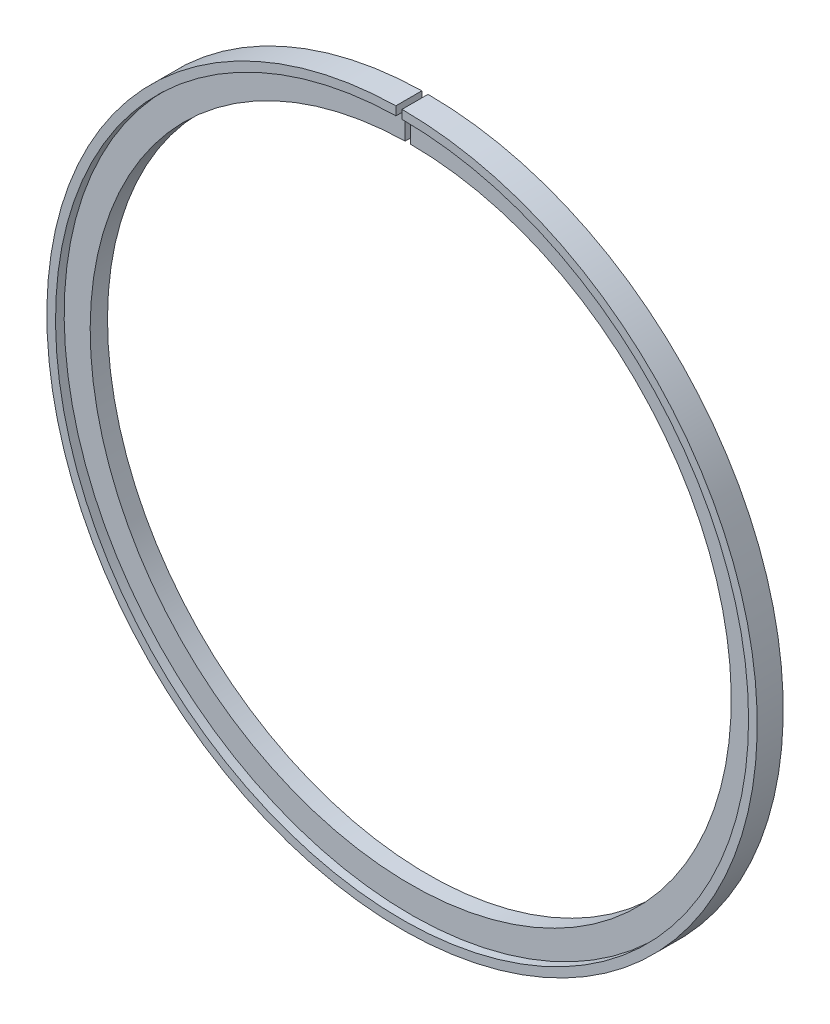
ISO-10303-21;
HEADER;
FILE_DESCRIPTION(('STEP AP214'),'2;1');
FILE_NAME('part.step','',(''),(''),'','','');
FILE_SCHEMA(('AUTOMOTIVE_DESIGN { 1 0 10303 214 1 1 1 1 }'));
ENDSEC;
DATA;
#1=APPLICATION_CONTEXT('core data for automotive mechanical design processes');
#2=APPLICATION_PROTOCOL_DEFINITION('international standard','automotive_design',2000,#1);
#3=PRODUCT_CONTEXT('',#1,'mechanical');
#4=PRODUCT('Part','Part','',(#3));
#5=PRODUCT_RELATED_PRODUCT_CATEGORY('part','',(#4));
#6=PRODUCT_DEFINITION_FORMATION('','',#4);
#7=PRODUCT_DEFINITION_CONTEXT('part definition',#1,'design');
#8=PRODUCT_DEFINITION('design','',#6,#7);
#9=PRODUCT_DEFINITION_SHAPE('','',#8);
#10=(LENGTH_UNIT() NAMED_UNIT(*) SI_UNIT(.MILLI.,.METRE.));
#11=(NAMED_UNIT(*) PLANE_ANGLE_UNIT() SI_UNIT($,.RADIAN.));
#12=(NAMED_UNIT(*) SI_UNIT($,.STERADIAN.) SOLID_ANGLE_UNIT());
#13=UNCERTAINTY_MEASURE_WITH_UNIT(LENGTH_MEASURE(1.E-05),#10,'distance_accuracy_value','');
#14=(GEOMETRIC_REPRESENTATION_CONTEXT(3) GLOBAL_UNCERTAINTY_ASSIGNED_CONTEXT((#13)) GLOBAL_UNIT_ASSIGNED_CONTEXT((#10,
#11,#12)) REPRESENTATION_CONTEXT('',''));
#15=CARTESIAN_POINT('',(0.,0.,0.));
#16=DIRECTION('',(0.,0.,1.));
#17=DIRECTION('',(1.,0.,0.));
#18=AXIS2_PLACEMENT_3D('',#15,#16,#17);
#19=CARTESIAN_POINT('',(0.,0.,2.));
#20=DIRECTION('',(0.,0.,1.));
#21=DIRECTION('',(1.,0.,0.));
#22=AXIS2_PLACEMENT_3D('',#19,#20,#21);
#23=PLANE('',#22);
#24=CARTESIAN_POINT('',(0.,0.,2.));
#25=DIRECTION('',(0.,0.,-1.));
#26=DIRECTION('',(1.,0.,0.));
#27=AXIS2_PLACEMENT_3D('',#24,#25,#26);
#28=CIRCLE('',#27,40.);
#29=CARTESIAN_POINT('',(-1.16927301174741E-13,40.,2.));
#30=VERTEX_POINT('',#29);
#31=CARTESIAN_POINT('',(-0.698096257491339,39.9939078062557,2.));
#32=VERTEX_POINT('',#31);
#33=EDGE_CURVE('E61',#30,#32,#28,.T.);
#34=ORIENTED_EDGE('',*,*,#33,.F.);
#35=DIRECTION('',(0.,-1.,0.));
#36=VECTOR('',#35,1.);
#37=CARTESIAN_POINT('',(0.,37.,2.));
#38=LINE('',#37,#36);
#39=CARTESIAN_POINT('',(0.,37.,2.));
#40=VERTEX_POINT('',#39);
#41=EDGE_CURVE('E66',#30,#40,#38,.T.);
#42=ORIENTED_EDGE('',*,*,#41,.T.);
#43=CARTESIAN_POINT('',(0.,0.,2.));
#44=DIRECTION('',(0.,0.,-1.));
#45=DIRECTION('',(1.,0.,0.));
#46=AXIS2_PLACEMENT_3D('',#43,#44,#45);
#47=CIRCLE('',#46,37.);
#48=CARTESIAN_POINT('',(-0.645739038179502,36.9943647207865,2.));
#49=VERTEX_POINT('',#48);
#50=EDGE_CURVE('E98',#40,#49,#47,.T.);
#51=ORIENTED_EDGE('',*,*,#50,.T.);
#52=DIRECTION('',(-0.0174524064372809,0.999847695156391,0.));
#53=VECTOR('',#52,1.);
#54=CARTESIAN_POINT('',(-0.645739038179502,36.9943647207865,2.));
#55=LINE('',#54,#53);
#56=EDGE_CURVE('E164',#49,#32,#55,.T.);
#57=ORIENTED_EDGE('',*,*,#56,.T.);
#58=EDGE_LOOP('',(#34,#42,#51,#57));
#59=FACE_BOUND('',#58,.T.);
#60=ADVANCED_FACE('F45',(#59),#23,.T.);
#61=CARTESIAN_POINT('',(0.,0.,2.));
#62=DIRECTION('',(0.,0.,-1.));
#63=DIRECTION('',(-1.,0.,0.));
#64=AXIS2_PLACEMENT_3D('',#61,#62,#63);
#65=CYLINDRICAL_SURFACE('',#64,37.);
#66=CARTESIAN_POINT('',(0.,0.,0.));
#67=DIRECTION('',(0.,0.,-1.));
#68=DIRECTION('',(1.,0.,0.));
#69=AXIS2_PLACEMENT_3D('',#66,#67,#68);
#70=CIRCLE('',#69,37.);
#71=CARTESIAN_POINT('',(0.,37.,0.));
#72=VERTEX_POINT('',#71);
#73=CARTESIAN_POINT('',(-0.645739038179502,36.9943647207865,0.));
#74=VERTEX_POINT('',#73);
#75=EDGE_CURVE('E104',#72,#74,#70,.T.);
#76=ORIENTED_EDGE('',*,*,#75,.T.);
#77=DIRECTION('',(0.,0.,-1.));
#78=VECTOR('',#77,1.);
#79=CARTESIAN_POINT('',(-0.645739038179502,36.9943647207865,2.));
#80=LINE('',#79,#78);
#81=EDGE_CURVE('E11',#49,#74,#80,.T.);
#82=ORIENTED_EDGE('',*,*,#81,.F.);
#83=ORIENTED_EDGE('',*,*,#50,.F.);
#84=DIRECTION('',(0.,0.,-1.));
#85=VECTOR('',#84,1.);
#86=CARTESIAN_POINT('',(0.,37.,2.));
#87=LINE('',#86,#85);
#88=EDGE_CURVE('E89',#40,#72,#87,.T.);
#89=ORIENTED_EDGE('',*,*,#88,.T.);
#90=EDGE_LOOP('',(#76,#82,#83,#89));
#91=FACE_BOUND('',#90,.T.);
#92=ADVANCED_FACE('F47',(#91),#65,.F.);
#93=CARTESIAN_POINT('',(-0.645739038179502,36.9943647207865,2.));
#94=DIRECTION('',(-0.999847695156391,-0.0174524064372809,0.));
#95=DIRECTION('',(0.0174524064372809,-0.999847695156391,0.));
#96=AXIS2_PLACEMENT_3D('',#93,#94,#95);
#97=PLANE('',#96);
#98=DIRECTION('',(-0.0174524064372809,0.999847695156391,0.));
#99=VECTOR('',#98,1.);
#100=CARTESIAN_POINT('',(-0.645739038179502,36.9943647207865,0.));
#101=LINE('',#100,#99);
#102=CARTESIAN_POINT('',(-0.715548663928622,40.993755501412,0.));
#103=VERTEX_POINT('',#102);
#104=EDGE_CURVE('E108',#74,#103,#101,.T.);
#105=ORIENTED_EDGE('',*,*,#104,.T.);
#106=DIRECTION('',(0.,0.,-1.));
#107=VECTOR('',#106,1.);
#108=CARTESIAN_POINT('',(-0.715548663928622,40.993755501412,2.));
#109=LINE('',#108,#107);
#110=CARTESIAN_POINT('',(-0.715548663928622,40.993755501412,3.));
#111=VERTEX_POINT('',#110);
#112=EDGE_CURVE('E54',#111,#103,#109,.T.);
#113=ORIENTED_EDGE('',*,*,#112,.F.);
#114=DIRECTION('',(-0.0174524064372836,0.999847695156391,0.));
#115=VECTOR('',#114,1.);
#116=CARTESIAN_POINT('',(-0.698096257491339,39.9939078062557,3.));
#117=LINE('',#116,#115);
#118=CARTESIAN_POINT('',(-0.698096257491339,39.9939078062557,3.));
#119=VERTEX_POINT('',#118);
#120=EDGE_CURVE('E138',#119,#111,#117,.T.);
#121=ORIENTED_EDGE('',*,*,#120,.F.);
#122=DIRECTION('',(0.,0.,-1.));
#123=VECTOR('',#122,1.);
#124=CARTESIAN_POINT('',(-0.698096257491339,39.9939078062557,3.));
#125=LINE('',#124,#123);
#126=EDGE_CURVE('E110',#119,#32,#125,.T.);
#127=ORIENTED_EDGE('',*,*,#126,.T.);
#128=ORIENTED_EDGE('',*,*,#56,.F.);
#129=ORIENTED_EDGE('',*,*,#81,.T.);
#130=EDGE_LOOP('',(#105,#113,#121,#127,#128,#129));
#131=FACE_BOUND('',#130,.T.);
#132=ADVANCED_FACE('F136',(#131),#97,.F.);
#133=CARTESIAN_POINT('',(0.,0.,2.));
#134=DIRECTION('',(0.,0.,-1.));
#135=DIRECTION('',(-1.,0.,0.));
#136=AXIS2_PLACEMENT_3D('',#133,#134,#135);
#137=CYLINDRICAL_SURFACE('',#136,41.);
#138=CARTESIAN_POINT('',(0.,0.,0.));
#139=DIRECTION('',(0.,0.,1.));
#140=DIRECTION('',(1.,0.,0.));
#141=AXIS2_PLACEMENT_3D('',#138,#139,#140);
#142=CIRCLE('',#141,41.);
#143=CARTESIAN_POINT('',(-1.55903068232988E-13,41.,0.));
#144=VERTEX_POINT('',#143);
#145=EDGE_CURVE('E99',#103,#144,#142,.T.);
#146=ORIENTED_EDGE('',*,*,#145,.T.);
#147=DIRECTION('',(0.,0.,-1.));
#148=VECTOR('',#147,1.);
#149=CARTESIAN_POINT('',(-1.55903068232988E-13,41.,2.));
#150=LINE('',#149,#148);
#151=CARTESIAN_POINT('',(-1.55903068232988E-13,41.,3.));
#152=VERTEX_POINT('',#151);
#153=EDGE_CURVE('E93',#152,#144,#150,.T.);
#154=ORIENTED_EDGE('',*,*,#153,.F.);
#155=CARTESIAN_POINT('',(0.,0.,3.));
#156=DIRECTION('',(0.,0.,1.));
#157=DIRECTION('',(1.,0.,0.));
#158=AXIS2_PLACEMENT_3D('',#155,#156,#157);
#159=CIRCLE('',#158,41.);
#160=EDGE_CURVE('E132',#111,#152,#159,.T.);
#161=ORIENTED_EDGE('',*,*,#160,.F.);
#162=ORIENTED_EDGE('',*,*,#112,.T.);
#163=EDGE_LOOP('',(#146,#154,#161,#162));
#164=FACE_BOUND('',#163,.T.);
#165=ADVANCED_FACE('F129',(#164),#137,.T.);
#166=CARTESIAN_POINT('',(0.,37.,2.));
#167=DIRECTION('',(1.,0.,0.));
#168=DIRECTION('',(0.,1.,0.));
#169=AXIS2_PLACEMENT_3D('',#166,#167,#168);
#170=PLANE('',#169);
#171=DIRECTION('',(0.,-1.,0.));
#172=VECTOR('',#171,1.);
#173=CARTESIAN_POINT('',(0.,37.,0.));
#174=LINE('',#173,#172);
#175=EDGE_CURVE('E86',#144,#72,#174,.T.);
#176=ORIENTED_EDGE('',*,*,#175,.T.);
#177=ORIENTED_EDGE('',*,*,#88,.F.);
#178=ORIENTED_EDGE('',*,*,#41,.F.);
#179=DIRECTION('',(0.,0.,-1.));
#180=VECTOR('',#179,1.);
#181=CARTESIAN_POINT('',(0.,40.,3.));
#182=LINE('',#181,#180);
#183=CARTESIAN_POINT('',(0.,40.,3.));
#184=VERTEX_POINT('',#183);
#185=EDGE_CURVE('E116',#184,#30,#182,.T.);
#186=ORIENTED_EDGE('',*,*,#185,.F.);
#187=DIRECTION('',(1.55903068232988E-13,-1.,0.));
#188=VECTOR('',#187,1.);
#189=CARTESIAN_POINT('',(0.,40.,3.));
#190=LINE('',#189,#188);
#191=EDGE_CURVE('E152',#152,#184,#190,.T.);
#192=ORIENTED_EDGE('',*,*,#191,.F.);
#193=ORIENTED_EDGE('',*,*,#153,.T.);
#194=EDGE_LOOP('',(#176,#177,#178,#186,#192,#193));
#195=FACE_BOUND('',#194,.T.);
#196=ADVANCED_FACE('F88',(#195),#170,.F.);
#197=CARTESIAN_POINT('',(0.,0.,0.));
#198=DIRECTION('',(0.,0.,1.));
#199=DIRECTION('',(1.,0.,0.));
#200=AXIS2_PLACEMENT_3D('',#197,#198,#199);
#201=PLANE('',#200);
#202=ORIENTED_EDGE('',*,*,#75,.F.);
#203=ORIENTED_EDGE('',*,*,#175,.F.);
#204=ORIENTED_EDGE('',*,*,#145,.F.);
#205=ORIENTED_EDGE('',*,*,#104,.F.);
#206=EDGE_LOOP('',(#202,#203,#204,#205));
#207=FACE_BOUND('',#206,.T.);
#208=ADVANCED_FACE('F107',(#207),#201,.F.);
#209=CARTESIAN_POINT('',(0.,0.,3.));
#210=DIRECTION('',(0.,0.,-1.));
#211=DIRECTION('',(-1.,0.,0.));
#212=AXIS2_PLACEMENT_3D('',#209,#210,#211);
#213=CYLINDRICAL_SURFACE('',#212,40.);
#214=ORIENTED_EDGE('',*,*,#33,.T.);
#215=ORIENTED_EDGE('',*,*,#126,.F.);
#216=CARTESIAN_POINT('',(0.,0.,3.));
#217=DIRECTION('',(0.,0.,-1.));
#218=DIRECTION('',(1.,0.,0.));
#219=AXIS2_PLACEMENT_3D('',#216,#217,#218);
#220=CIRCLE('',#219,40.);
#221=EDGE_CURVE('E146',#184,#119,#220,.T.);
#222=ORIENTED_EDGE('',*,*,#221,.F.);
#223=ORIENTED_EDGE('',*,*,#185,.T.);
#224=EDGE_LOOP('',(#214,#215,#222,#223));
#225=FACE_BOUND('',#224,.T.);
#226=ADVANCED_FACE('F169',(#225),#213,.F.);
#227=CARTESIAN_POINT('',(0.,0.,3.));
#228=DIRECTION('',(0.,0.,1.));
#229=DIRECTION('',(1.,0.,0.));
#230=AXIS2_PLACEMENT_3D('',#227,#228,#229);
#231=PLANE('',#230);
#232=ORIENTED_EDGE('',*,*,#221,.T.);
#233=ORIENTED_EDGE('',*,*,#120,.T.);
#234=ORIENTED_EDGE('',*,*,#160,.T.);
#235=ORIENTED_EDGE('',*,*,#191,.T.);
#236=EDGE_LOOP('',(#232,#233,#234,#235));
#237=FACE_BOUND('',#236,.T.);
#238=ADVANCED_FACE('F143',(#237),#231,.T.);
#239=CLOSED_SHELL('',(#60,#92,#132,#165,#196,#208,#226,#238));
#240=MANIFOLD_SOLID_BREP('B2',#239);
#241=ADVANCED_BREP_SHAPE_REPRESENTATION('',(#18,#240),#14);
#242=SHAPE_DEFINITION_REPRESENTATION(#9,#241);
ENDSEC;
END-ISO-10303-21;
